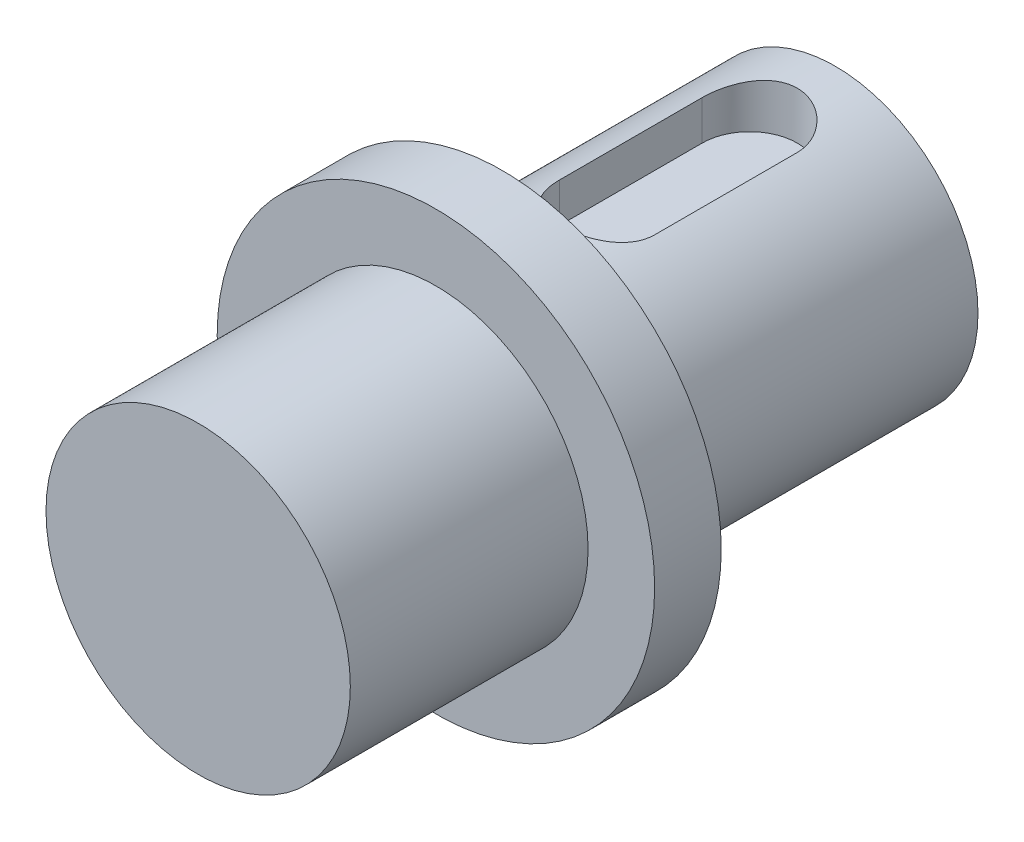
ISO-10303-21;
HEADER;
FILE_DESCRIPTION(('STEP AP214'),'2;1');
FILE_NAME('part.step','',(''),(''),'','','');
FILE_SCHEMA(('AUTOMOTIVE_DESIGN { 1 0 10303 214 1 1 1 1 }'));
ENDSEC;
DATA;
#1=APPLICATION_CONTEXT('core data for automotive mechanical design processes');
#2=APPLICATION_PROTOCOL_DEFINITION('international standard','automotive_design',2000,#1);
#3=PRODUCT_CONTEXT('',#1,'mechanical');
#4=PRODUCT('Part','Part','',(#3));
#5=PRODUCT_RELATED_PRODUCT_CATEGORY('part','',(#4));
#6=PRODUCT_DEFINITION_FORMATION('','',#4);
#7=PRODUCT_DEFINITION_CONTEXT('part definition',#1,'design');
#8=PRODUCT_DEFINITION('design','',#6,#7);
#9=PRODUCT_DEFINITION_SHAPE('','',#8);
#10=(LENGTH_UNIT() NAMED_UNIT(*) SI_UNIT(.MILLI.,.METRE.));
#11=(NAMED_UNIT(*) PLANE_ANGLE_UNIT() SI_UNIT($,.RADIAN.));
#12=(NAMED_UNIT(*) SI_UNIT($,.STERADIAN.) SOLID_ANGLE_UNIT());
#13=UNCERTAINTY_MEASURE_WITH_UNIT(LENGTH_MEASURE(1.E-05),#10,'distance_accuracy_value','');
#14=(GEOMETRIC_REPRESENTATION_CONTEXT(3) GLOBAL_UNCERTAINTY_ASSIGNED_CONTEXT((#13)) GLOBAL_UNIT_ASSIGNED_CONTEXT((#10,
#11,#12)) REPRESENTATION_CONTEXT('',''));
#15=CARTESIAN_POINT('',(0.,0.,0.));
#16=DIRECTION('',(0.,0.,1.));
#17=DIRECTION('',(1.,0.,0.));
#18=AXIS2_PLACEMENT_3D('',#15,#16,#17);
#19=CARTESIAN_POINT('',(0.,0.,35.));
#20=DIRECTION('',(0.,0.,-1.));
#21=DIRECTION('',(-1.,0.,0.));
#22=AXIS2_PLACEMENT_3D('',#19,#20,#21);
#23=CYLINDRICAL_SURFACE('',#22,15.);
#24=CARTESIAN_POINT('',(0.,0.,0.));
#25=DIRECTION('',(0.,0.,1.));
#26=DIRECTION('',(1.,0.,0.));
#27=AXIS2_PLACEMENT_3D('',#24,#25,#26);
#28=CIRCLE('',#27,15.);
#29=CARTESIAN_POINT('',(15.,0.,0.));
#30=VERTEX_POINT('',#29);
#31=EDGE_CURVE('E113',#30,#30,#28,.T.);
#32=ORIENTED_EDGE('',*,*,#31,.T.);
#33=EDGE_LOOP('',(#32));
#34=FACE_BOUND('',#33,.T.);
#35=CARTESIAN_POINT('',(0.,0.,35.));
#36=DIRECTION('',(0.,0.,1.));
#37=DIRECTION('',(1.,0.,0.));
#38=AXIS2_PLACEMENT_3D('',#35,#36,#37);
#39=CIRCLE('',#38,15.);
#40=CARTESIAN_POINT('',(15.,0.,35.));
#41=VERTEX_POINT('',#40);
#42=EDGE_CURVE('E116',#41,#41,#39,.T.);
#43=ORIENTED_EDGE('',*,*,#42,.F.);
#44=EDGE_LOOP('',(#43));
#45=FACE_BOUND('',#44,.T.);
#46=CARTESIAN_POINT('',(-5.,14.142135623731,24.));
#47=CARTESIAN_POINT('',(-5.00001928272081,14.1421132795953,24.1364118279069));
#48=CARTESIAN_POINT('',(-4.99441839460028,14.144108585197,24.272814985641));
#49=CARTESIAN_POINT('',(-4.97212026561631,14.1519707752355,24.5445632400942));
#50=CARTESIAN_POINT('',(-4.95542602013328,14.1578366145644,24.6799086124535));
#51=CARTESIAN_POINT('',(-4.91115048442878,14.1732535212275,24.948178657101));
#52=CARTESIAN_POINT('',(-4.88360148534076,14.182793656248,25.0811092969029));
#53=CARTESIAN_POINT('',(-4.81787909036062,14.2052544389481,25.3440246456576));
#54=CARTESIAN_POINT('',(-4.77970531049258,14.2181752088016,25.474009247958));
#55=CARTESIAN_POINT('',(-4.69309505128876,14.2469974292543,25.7300589983299));
#56=CARTESIAN_POINT('',(-4.64466686529954,14.2628964699579,25.8561272198932));
#57=CARTESIAN_POINT('',(-4.53792631398361,14.2972152683245,26.1036685479402));
#58=CARTESIAN_POINT('',(-4.47961026060573,14.3156359660384,26.2251399191016));
#59=CARTESIAN_POINT('',(-4.29042487291366,14.3739242294785,26.5815689284128));
#60=CARTESIAN_POINT('',(-4.14528130436108,14.4168308914588,26.8086501836388));
#61=CARTESIAN_POINT('',(-3.81524041281298,14.5077282855086,27.243637870338));
#62=CARTESIAN_POINT('',(-3.62912046165332,14.5558450324036,27.4505842489828));
#63=CARTESIAN_POINT('',(-3.22494665570402,14.6506912904573,27.8310202405372));
#64=CARTESIAN_POINT('',(-3.00688712664699,14.6974205533429,28.0045038958684));
#65=CARTESIAN_POINT('',(-2.53801699448498,14.7856944680589,28.3174003341321));
#66=CARTESIAN_POINT('',(-2.2865001167083,14.8270719634014,28.4558056562606));
#67=CARTESIAN_POINT('',(-1.76214657981254,14.8984803449503,28.6879605244115));
#68=CARTESIAN_POINT('',(-1.48931646315729,14.9285146967399,28.7817237118873));
#69=CARTESIAN_POINT('',(-0.940146645163364,14.9729535792742,28.9186788208116));
#70=CARTESIAN_POINT('',(-0.664259156539227,14.9878654569488,28.9635164270977));
#71=CARTESIAN_POINT('',(-0.108494863035934,15.0021804126725,29.0065814283141));
#72=CARTESIAN_POINT('',(0.171380975391813,15.0015871861129,29.0048199293876));
#73=CARTESIAN_POINT('',(0.715519207983848,14.9853019394036,28.9557786488014));
#74=CARTESIAN_POINT('',(0.979963426374046,14.9702030725849,28.9102870031268));
#75=CARTESIAN_POINT('',(1.49722040864174,14.9273480020182,28.7780338136946));
#76=CARTESIAN_POINT('',(1.75003252671059,14.8995910964333,28.69126998155));
#77=CARTESIAN_POINT('',(2.24076278220402,14.8337834991293,28.4778938687204));
#78=CARTESIAN_POINT('',(2.47844127676377,14.7956022127902,28.3507724620934));
#79=CARTESIAN_POINT('',(2.92962419733441,14.7129190630403,28.0606975546095));
#80=CARTESIAN_POINT('',(3.14312202351086,14.6684154814678,27.8977343066695));
#81=CARTESIAN_POINT('',(3.55048180391262,14.5753148518701,27.5316552598699));
#82=CARTESIAN_POINT('',(3.74294939170374,14.5266237190253,27.3270123621527));
#83=CARTESIAN_POINT('',(4.09137879648192,14.4323697370697,26.8877524582914));
#84=CARTESIAN_POINT('',(4.24732881968225,14.3868079019513,26.6531258062456));
#85=CARTESIAN_POINT('',(4.45137197181612,14.3244699574743,26.281608812031));
#86=CARTESIAN_POINT('',(4.51477947987294,14.3045606178995,26.1534307440413));
#87=CARTESIAN_POINT('',(4.63050119526385,14.2675208843929,25.891793773804));
#88=CARTESIAN_POINT('',(4.68282002045479,14.2503893343581,25.7583370974053));
#89=CARTESIAN_POINT('',(4.77584283639463,14.2194841629367,25.4872286417921));
#90=CARTESIAN_POINT('',(4.81655946314398,14.2057068907929,25.34958160862));
#91=CARTESIAN_POINT('',(4.88604801985988,14.1819560641116,25.0710398069407));
#92=CARTESIAN_POINT('',(4.91482540411389,14.1719807728584,24.9301465525477));
#93=CARTESIAN_POINT('',(4.95827453687231,14.1568366544479,24.6579469418116));
#94=CARTESIAN_POINT('',(4.97391718926365,14.1513381564974,24.5268131005267));
#95=CARTESIAN_POINT('',(4.99478118687354,14.143980412972,24.2637895841252));
#96=CARTESIAN_POINT('',(5.00001597952917,14.1421164714419,24.1319011054151));
#97=CARTESIAN_POINT('',(5.00000000000001,14.142135623731,24.));
#98=B_SPLINE_CURVE_WITH_KNOTS('',3,(#46,#47,#48,#49,#50,#51,#52,#53,#54,#55,#56,#57,#58,#59,#60,
#61,#62,#63,#64,#65,#66,#67,#68,#69,#70,#71,#72,#73,#74,#75,#76,#77,#78,#79,#80,#81,#82,#83,#84,
#85,#86,#87,#88,#89,#90,#91,#92,#93,#94,#95,#96,#97),.UNSPECIFIED.,.F.,.F.,(4,2,2,2,2,2,2,2,2,2,
2,2,2,2,2,2,2,2,2,2,2,2,2,2,2,4),(0.,0.409092423677161,0.818074430847308,1.22584885885815,
1.63363802561078,2.04109864022585,2.44871156823776,3.26359482908313,4.10724851154046,
4.95105225659395,5.81687991006164,6.68244281946294,7.51789679977672,8.3531516649387,
9.15564418669334,9.95818120881897,10.771274204705,11.584588592845,12.4361259663091,
13.2879379758687,13.7206337000479,14.1531488734623,14.5851911765746,15.0170358888757,
15.4131122811713,15.8086765909866),.UNSPECIFIED.);
#99=CARTESIAN_POINT('',(-5.,14.142135623731,24.));
#100=VERTEX_POINT('',#99);
#101=CARTESIAN_POINT('',(5.00000000000001,14.1421356237309,24.));
#102=VERTEX_POINT('',#101);
#103=EDGE_CURVE('E11',#100,#102,#98,.T.);
#104=ORIENTED_EDGE('',*,*,#103,.F.);
#105=DIRECTION('',(0.,0.,-1.));
#106=VECTOR('',#105,1.);
#107=CARTESIAN_POINT('',(-5.,14.142135623731,35.));
#108=LINE('',#107,#106);
#109=CARTESIAN_POINT('',(-5.,14.142135623731,9.));
#110=VERTEX_POINT('',#109);
#111=EDGE_CURVE('E119',#110,#100,#108,.F.);
#112=ORIENTED_EDGE('',*,*,#111,.F.);
#113=CARTESIAN_POINT('',(5.,14.142135623731,9.));
#114=CARTESIAN_POINT('',(5.00001928272081,14.1421132795953,8.86358817209313));
#115=CARTESIAN_POINT('',(4.99441839460028,14.144108585197,8.72718501435901));
#116=CARTESIAN_POINT('',(4.97212026561632,14.1519707752355,8.45543675990579));
#117=CARTESIAN_POINT('',(4.95542602013328,14.1578366145644,8.3200913875465));
#118=CARTESIAN_POINT('',(4.91115048442879,14.1732535212275,8.05182134289903));
#119=CARTESIAN_POINT('',(4.88360148534076,14.182793656248,7.91889070309714));
#120=CARTESIAN_POINT('',(4.81787909036063,14.2052544389481,7.65597535434243));
#121=CARTESIAN_POINT('',(4.77970531049259,14.2181752088016,7.52599075204203));
#122=CARTESIAN_POINT('',(4.69309505128876,14.2469974292543,7.26994100167007));
#123=CARTESIAN_POINT('',(4.64466686529954,14.2628964699579,7.14387278010677));
#124=CARTESIAN_POINT('',(4.53792631398361,14.2972152683245,6.8963314520598));
#125=CARTESIAN_POINT('',(4.47961026060573,14.3156359660384,6.77486008089838));
#126=CARTESIAN_POINT('',(4.29042487291366,14.3739242294785,6.4184310715872));
#127=CARTESIAN_POINT('',(4.14528130436109,14.4168308914588,6.19134981636118));
#128=CARTESIAN_POINT('',(3.81524041281298,14.5077282855086,5.75636212966205));
#129=CARTESIAN_POINT('',(3.62912046165332,14.5558450324036,5.54941575101716));
#130=CARTESIAN_POINT('',(3.22494665570402,14.6506912904573,5.16897975946275));
#131=CARTESIAN_POINT('',(3.006887126647,14.6974205533429,4.99549610413162));
#132=CARTESIAN_POINT('',(2.53801699448498,14.7856944680589,4.68259966586794));
#133=CARTESIAN_POINT('',(2.2865001167083,14.8270719634014,4.54419434373935));
#134=CARTESIAN_POINT('',(1.76214657981255,14.8984803449503,4.31203947558852));
#135=CARTESIAN_POINT('',(1.48931646315729,14.9285146967399,4.21827628811271));
#136=CARTESIAN_POINT('',(0.94014664516337,14.9729535792742,4.08132117918844));
#137=CARTESIAN_POINT('',(0.664259156539232,14.9878654569488,4.03648357290232));
#138=CARTESIAN_POINT('',(0.108494863035938,15.0021804126725,3.99341857168589));
#139=CARTESIAN_POINT('',(-0.171380975391809,15.0015871861129,3.99518007061241));
#140=CARTESIAN_POINT('',(-0.715519207983844,14.9853019394036,4.04422135119862));
#141=CARTESIAN_POINT('',(-0.979963426374042,14.9702030725849,4.08971299687324));
#142=CARTESIAN_POINT('',(-1.49722040864173,14.9273480020182,4.22196618630537));
#143=CARTESIAN_POINT('',(-1.75003252671059,14.8995910964333,4.30873001844996));
#144=CARTESIAN_POINT('',(-2.24076278220401,14.8337834991293,4.52210613127959));
#145=CARTESIAN_POINT('',(-2.47844127676376,14.7956022127902,4.64922753790655));
#146=CARTESIAN_POINT('',(-2.92962419733441,14.7129190630403,4.93930244539046));
#147=CARTESIAN_POINT('',(-3.14312202351085,14.6684154814678,5.10226569333055));
#148=CARTESIAN_POINT('',(-3.55048180391262,14.5753148518701,5.46834474013008));
#149=CARTESIAN_POINT('',(-3.74294939170373,14.5266237190253,5.67298763784732));
#150=CARTESIAN_POINT('',(-4.09137879648192,14.4323697370697,6.11224754170862));
#151=CARTESIAN_POINT('',(-4.24732881968225,14.3868079019513,6.34687419375444));
#152=CARTESIAN_POINT('',(-4.45137197181612,14.3244699574743,6.71839118796905));
#153=CARTESIAN_POINT('',(-4.51477947987294,14.3045606178995,6.84656925595869));
#154=CARTESIAN_POINT('',(-4.63050119526385,14.2675208843929,7.10820622619605));
#155=CARTESIAN_POINT('',(-4.68282002045479,14.2503893343581,7.24166290259467));
#156=CARTESIAN_POINT('',(-4.77584283639463,14.2194841629367,7.51277135820791));
#157=CARTESIAN_POINT('',(-4.81655946314398,14.2057068907929,7.65041839138002));
#158=CARTESIAN_POINT('',(-4.88604801985988,14.1819560641116,7.92896019305926));
#159=CARTESIAN_POINT('',(-4.91482540411389,14.1719807728584,8.0698534474523));
#160=CARTESIAN_POINT('',(-4.9582745368723,14.1568366544479,8.34205305818844));
#161=CARTESIAN_POINT('',(-4.97391718926365,14.1513381564974,8.47318689947325));
#162=CARTESIAN_POINT('',(-4.99478118687353,14.143980412972,8.7362104158748));
#163=CARTESIAN_POINT('',(-5.00001597952916,14.1421164714419,8.86809889458486));
#164=CARTESIAN_POINT('',(-5.,14.142135623731,9.));
#165=B_SPLINE_CURVE_WITH_KNOTS('',3,(#113,#114,#115,#116,#117,#118,#119,#120,#121,#122,#123,
#124,#125,#126,#127,#128,#129,#130,#131,#132,#133,#134,#135,#136,#137,#138,#139,#140,#141,#142,
#143,#144,#145,#146,#147,#148,#149,#150,#151,#152,#153,#154,#155,#156,#157,#158,#159,#160,#161,
#162,#163,#164),.UNSPECIFIED.,.F.,.F.,(4,2,2,2,2,2,2,2,2,2,2,2,2,2,2,2,2,2,2,2,2,2,2,2,2,4),(0.,
0.409092423677164,0.81807443084731,1.22584885885815,1.63363802561078,2.04109864022586,
2.44871156823776,3.26359482908313,4.10724851154046,4.95105225659395,5.81687991006164,
6.68244281946294,7.51789679977672,8.3531516649387,9.15564418669334,9.95818120881898,
10.771274204705,11.584588592845,12.4361259663091,13.2879379758687,13.7206337000479,
14.1531488734623,14.5851911765746,15.0170358888757,15.4131122811713,15.8086765909866),.UNSPECIFIED.);
#166=CARTESIAN_POINT('',(5.,14.142135623731,9.));
#167=VERTEX_POINT('',#166);
#168=EDGE_CURVE('E123',#167,#110,#165,.T.);
#169=ORIENTED_EDGE('',*,*,#168,.F.);
#170=DIRECTION('',(0.,0.,-1.));
#171=VECTOR('',#170,1.);
#172=CARTESIAN_POINT('',(5.,14.1421356237309,35.));
#173=LINE('',#172,#171);
#174=EDGE_CURVE('E44',#102,#167,#173,.T.);
#175=ORIENTED_EDGE('',*,*,#174,.F.);
#176=EDGE_LOOP('',(#104,#112,#169,#175));
#177=FACE_BOUND('',#176,.T.);
#178=ADVANCED_FACE('F32',(#34,#45,#177),#23,.T.);
#179=CARTESIAN_POINT('',(0.,0.,0.));
#180=DIRECTION('',(0.,0.,1.));
#181=DIRECTION('',(1.,0.,0.));
#182=AXIS2_PLACEMENT_3D('',#179,#180,#181);
#183=PLANE('',#182);
#184=ORIENTED_EDGE('',*,*,#31,.F.);
#185=EDGE_LOOP('',(#184));
#186=FACE_BOUND('',#185,.T.);
#187=ADVANCED_FACE('F158',(#186),#183,.F.);
#188=CARTESIAN_POINT('',(0.,0.,42.));
#189=DIRECTION('',(0.,0.,-1.));
#190=DIRECTION('',(-1.,0.,0.));
#191=AXIS2_PLACEMENT_3D('',#188,#189,#190);
#192=CYLINDRICAL_SURFACE('',#191,23.);
#193=CARTESIAN_POINT('',(0.,0.,42.));
#194=DIRECTION('',(0.,0.,1.));
#195=DIRECTION('',(1.,0.,0.));
#196=AXIS2_PLACEMENT_3D('',#193,#194,#195);
#197=CIRCLE('',#196,23.);
#198=CARTESIAN_POINT('',(23.,0.,42.));
#199=VERTEX_POINT('',#198);
#200=EDGE_CURVE('E110',#199,#199,#197,.T.);
#201=ORIENTED_EDGE('',*,*,#200,.F.);
#202=EDGE_LOOP('',(#201));
#203=FACE_BOUND('',#202,.T.);
#204=CARTESIAN_POINT('',(0.,0.,35.));
#205=DIRECTION('',(0.,0.,1.));
#206=DIRECTION('',(1.,0.,0.));
#207=AXIS2_PLACEMENT_3D('',#204,#205,#206);
#208=CIRCLE('',#207,23.);
#209=CARTESIAN_POINT('',(23.,0.,35.));
#210=VERTEX_POINT('',#209);
#211=EDGE_CURVE('E107',#210,#210,#208,.T.);
#212=ORIENTED_EDGE('',*,*,#211,.T.);
#213=EDGE_LOOP('',(#212));
#214=FACE_BOUND('',#213,.T.);
#215=ADVANCED_FACE('F152',(#203,#214),#192,.T.);
#216=CARTESIAN_POINT('',(0.,0.,42.));
#217=DIRECTION('',(0.,0.,1.));
#218=DIRECTION('',(1.,0.,0.));
#219=AXIS2_PLACEMENT_3D('',#216,#217,#218);
#220=PLANE('',#219);
#221=CARTESIAN_POINT('',(0.,0.,42.));
#222=DIRECTION('',(0.,0.,1.));
#223=DIRECTION('',(1.,0.,0.));
#224=AXIS2_PLACEMENT_3D('',#221,#222,#223);
#225=CIRCLE('',#224,16.);
#226=CARTESIAN_POINT('',(16.,0.,42.));
#227=VERTEX_POINT('',#226);
#228=EDGE_CURVE('E81',#227,#227,#225,.T.);
#229=ORIENTED_EDGE('',*,*,#228,.F.);
#230=EDGE_LOOP('',(#229));
#231=FACE_BOUND('',#230,.T.);
#232=ORIENTED_EDGE('',*,*,#200,.T.);
#233=EDGE_LOOP('',(#232));
#234=FACE_BOUND('',#233,.T.);
#235=ADVANCED_FACE('F149',(#231,#234),#220,.T.);
#236=CARTESIAN_POINT('',(0.,0.,35.));
#237=DIRECTION('',(0.,0.,1.));
#238=DIRECTION('',(1.,0.,0.));
#239=AXIS2_PLACEMENT_3D('',#236,#237,#238);
#240=PLANE('',#239);
#241=ORIENTED_EDGE('',*,*,#42,.T.);
#242=EDGE_LOOP('',(#241));
#243=FACE_BOUND('',#242,.T.);
#244=ORIENTED_EDGE('',*,*,#211,.F.);
#245=EDGE_LOOP('',(#244));
#246=FACE_BOUND('',#245,.T.);
#247=ADVANCED_FACE('F147',(#243,#246),#240,.F.);
#248=CARTESIAN_POINT('',(0.,0.,67.));
#249=DIRECTION('',(0.,0.,-1.));
#250=DIRECTION('',(-1.,0.,0.));
#251=AXIS2_PLACEMENT_3D('',#248,#249,#250);
#252=CYLINDRICAL_SURFACE('',#251,16.);
#253=CARTESIAN_POINT('',(0.,0.,67.));
#254=DIRECTION('',(0.,0.,1.));
#255=DIRECTION('',(1.,0.,0.));
#256=AXIS2_PLACEMENT_3D('',#253,#254,#255);
#257=CIRCLE('',#256,16.);
#258=CARTESIAN_POINT('',(16.,0.,67.));
#259=VERTEX_POINT('',#258);
#260=EDGE_CURVE('E104',#259,#259,#257,.T.);
#261=ORIENTED_EDGE('',*,*,#260,.F.);
#262=EDGE_LOOP('',(#261));
#263=FACE_BOUND('',#262,.T.);
#264=ORIENTED_EDGE('',*,*,#228,.T.);
#265=EDGE_LOOP('',(#264));
#266=FACE_BOUND('',#265,.T.);
#267=ADVANCED_FACE('F143',(#263,#266),#252,.T.);
#268=CARTESIAN_POINT('',(0.,0.,67.));
#269=DIRECTION('',(0.,0.,1.));
#270=DIRECTION('',(1.,0.,0.));
#271=AXIS2_PLACEMENT_3D('',#268,#269,#270);
#272=PLANE('',#271);
#273=ORIENTED_EDGE('',*,*,#260,.T.);
#274=EDGE_LOOP('',(#273));
#275=FACE_BOUND('',#274,.T.);
#276=ADVANCED_FACE('F140',(#275),#272,.T.);
#277=CARTESIAN_POINT('',(0.,35.,24.));
#278=DIRECTION('',(0.,-1.,0.));
#279=DIRECTION('',(0.,0.,-1.));
#280=AXIS2_PLACEMENT_3D('',#277,#278,#279);
#281=CYLINDRICAL_SURFACE('',#280,5.);
#282=ORIENTED_EDGE('',*,*,#103,.T.);
#283=DIRECTION('',(0.,-1.,0.));
#284=VECTOR('',#283,1.);
#285=CARTESIAN_POINT('',(5.00000000000001,35.,24.));
#286=LINE('',#285,#284);
#287=CARTESIAN_POINT('',(5.00000000000001,10.,24.));
#288=VERTEX_POINT('',#287);
#289=EDGE_CURVE('E74',#102,#288,#286,.T.);
#290=ORIENTED_EDGE('',*,*,#289,.T.);
#291=CARTESIAN_POINT('',(0.,10.,24.));
#292=DIRECTION('',(0.,1.,0.));
#293=DIRECTION('',(0.,0.,1.));
#294=AXIS2_PLACEMENT_3D('',#291,#292,#293);
#295=CIRCLE('',#294,5.);
#296=CARTESIAN_POINT('',(-5.,10.,24.));
#297=VERTEX_POINT('',#296);
#298=EDGE_CURVE('E78',#297,#288,#295,.T.);
#299=ORIENTED_EDGE('',*,*,#298,.F.);
#300=DIRECTION('',(0.,-1.,0.));
#301=VECTOR('',#300,1.);
#302=CARTESIAN_POINT('',(-5.,35.,24.));
#303=LINE('',#302,#301);
#304=EDGE_CURVE('E100',#100,#297,#303,.T.);
#305=ORIENTED_EDGE('',*,*,#304,.F.);
#306=EDGE_LOOP('',(#282,#290,#299,#305));
#307=FACE_BOUND('',#306,.T.);
#308=ADVANCED_FACE('F76',(#307),#281,.F.);
#309=CARTESIAN_POINT('',(5.00000000000001,35.,24.));
#310=DIRECTION('',(-1.,0.,0.));
#311=DIRECTION('',(0.,0.,1.));
#312=AXIS2_PLACEMENT_3D('',#309,#310,#311);
#313=PLANE('',#312);
#314=ORIENTED_EDGE('',*,*,#174,.T.);
#315=DIRECTION('',(0.,-1.,0.));
#316=VECTOR('',#315,1.);
#317=CARTESIAN_POINT('',(5.,35.,9.));
#318=LINE('',#317,#316);
#319=CARTESIAN_POINT('',(5.,10.,9.));
#320=VERTEX_POINT('',#319);
#321=EDGE_CURVE('E82',#167,#320,#318,.T.);
#322=ORIENTED_EDGE('',*,*,#321,.T.);
#323=DIRECTION('',(0.,0.,-1.));
#324=VECTOR('',#323,1.);
#325=CARTESIAN_POINT('',(5.00000000000001,10.,24.));
#326=LINE('',#325,#324);
#327=EDGE_CURVE('E85',#288,#320,#326,.T.);
#328=ORIENTED_EDGE('',*,*,#327,.F.);
#329=ORIENTED_EDGE('',*,*,#289,.F.);
#330=EDGE_LOOP('',(#314,#322,#328,#329));
#331=FACE_BOUND('',#330,.T.);
#332=ADVANCED_FACE('F86',(#331),#313,.T.);
#333=CARTESIAN_POINT('',(0.,35.,9.));
#334=DIRECTION('',(0.,-1.,0.));
#335=DIRECTION('',(0.,0.,-1.));
#336=AXIS2_PLACEMENT_3D('',#333,#334,#335);
#337=CYLINDRICAL_SURFACE('',#336,5.);
#338=ORIENTED_EDGE('',*,*,#168,.T.);
#339=DIRECTION('',(0.,-1.,0.));
#340=VECTOR('',#339,1.);
#341=CARTESIAN_POINT('',(-5.,35.,9.));
#342=LINE('',#341,#340);
#343=CARTESIAN_POINT('',(-5.,10.,9.));
#344=VERTEX_POINT('',#343);
#345=EDGE_CURVE('E51',#110,#344,#342,.T.);
#346=ORIENTED_EDGE('',*,*,#345,.T.);
#347=CARTESIAN_POINT('',(0.,10.,9.));
#348=DIRECTION('',(0.,1.,0.));
#349=DIRECTION('',(0.,0.,1.));
#350=AXIS2_PLACEMENT_3D('',#347,#348,#349);
#351=CIRCLE('',#350,5.);
#352=EDGE_CURVE('E91',#320,#344,#351,.T.);
#353=ORIENTED_EDGE('',*,*,#352,.F.);
#354=ORIENTED_EDGE('',*,*,#321,.F.);
#355=EDGE_LOOP('',(#338,#346,#353,#354));
#356=FACE_BOUND('',#355,.T.);
#357=ADVANCED_FACE('F128',(#356),#337,.F.);
#358=CARTESIAN_POINT('',(-5.,35.,9.));
#359=DIRECTION('',(1.,0.,0.));
#360=DIRECTION('',(0.,0.,-1.));
#361=AXIS2_PLACEMENT_3D('',#358,#359,#360);
#362=PLANE('',#361);
#363=ORIENTED_EDGE('',*,*,#111,.T.);
#364=ORIENTED_EDGE('',*,*,#304,.T.);
#365=DIRECTION('',(0.,0.,1.));
#366=VECTOR('',#365,1.);
#367=CARTESIAN_POINT('',(-5.,10.,9.));
#368=LINE('',#367,#366);
#369=EDGE_CURVE('E95',#344,#297,#368,.T.);
#370=ORIENTED_EDGE('',*,*,#369,.F.);
#371=ORIENTED_EDGE('',*,*,#345,.F.);
#372=EDGE_LOOP('',(#363,#364,#370,#371));
#373=FACE_BOUND('',#372,.T.);
#374=ADVANCED_FACE('F133',(#373),#362,.T.);
#375=CARTESIAN_POINT('',(0.,10.,24.));
#376=DIRECTION('',(0.,1.,0.));
#377=DIRECTION('',(0.,0.,1.));
#378=AXIS2_PLACEMENT_3D('',#375,#376,#377);
#379=PLANE('',#378);
#380=ORIENTED_EDGE('',*,*,#298,.T.);
#381=ORIENTED_EDGE('',*,*,#327,.T.);
#382=ORIENTED_EDGE('',*,*,#352,.T.);
#383=ORIENTED_EDGE('',*,*,#369,.T.);
#384=EDGE_LOOP('',(#380,#381,#382,#383));
#385=FACE_BOUND('',#384,.T.);
#386=ADVANCED_FACE('F94',(#385),#379,.T.);
#387=CLOSED_SHELL('',(#178,#187,#215,#235,#247,#267,#276,#308,#332,#357,#374,#386));
#388=MANIFOLD_SOLID_BREP('B2',#387);
#389=ADVANCED_BREP_SHAPE_REPRESENTATION('',(#18,#388),#14);
#390=SHAPE_DEFINITION_REPRESENTATION(#9,#389);
ENDSEC;
END-ISO-10303-21;
